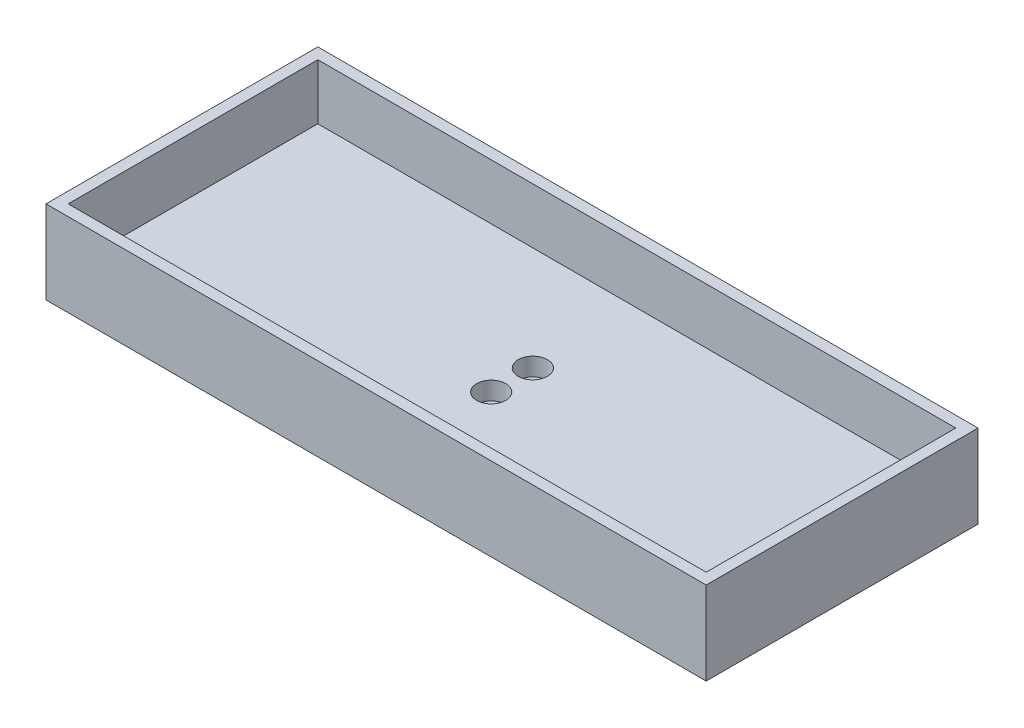
ISO-10303-21;
HEADER;
FILE_DESCRIPTION(('STEP AP214'),'2;1');
FILE_NAME('part.step','',(''),(''),'','','');
FILE_SCHEMA(('AUTOMOTIVE_DESIGN { 1 0 10303 214 1 1 1 1 }'));
ENDSEC;
DATA;
#1=APPLICATION_CONTEXT('core data for automotive mechanical design processes');
#2=APPLICATION_PROTOCOL_DEFINITION('international standard','automotive_design',2000,#1);
#3=PRODUCT_CONTEXT('',#1,'mechanical');
#4=PRODUCT('Part','Part','',(#3));
#5=PRODUCT_RELATED_PRODUCT_CATEGORY('part','',(#4));
#6=PRODUCT_DEFINITION_FORMATION('','',#4);
#7=PRODUCT_DEFINITION_CONTEXT('part definition',#1,'design');
#8=PRODUCT_DEFINITION('design','',#6,#7);
#9=PRODUCT_DEFINITION_SHAPE('','',#8);
#10=(LENGTH_UNIT() NAMED_UNIT(*) SI_UNIT(.MILLI.,.METRE.));
#11=(NAMED_UNIT(*) PLANE_ANGLE_UNIT() SI_UNIT($,.RADIAN.));
#12=(NAMED_UNIT(*) SI_UNIT($,.STERADIAN.) SOLID_ANGLE_UNIT());
#13=UNCERTAINTY_MEASURE_WITH_UNIT(LENGTH_MEASURE(1.E-05),#10,'distance_accuracy_value','');
#14=(GEOMETRIC_REPRESENTATION_CONTEXT(3) GLOBAL_UNCERTAINTY_ASSIGNED_CONTEXT((#13)) GLOBAL_UNIT_ASSIGNED_CONTEXT((#10,
#11,#12)) REPRESENTATION_CONTEXT('',''));
#15=CARTESIAN_POINT('',(0.,0.,0.));
#16=DIRECTION('',(0.,0.,1.));
#17=DIRECTION('',(1.,0.,0.));
#18=AXIS2_PLACEMENT_3D('',#15,#16,#17);
#19=CARTESIAN_POINT('',(0.,10.,0.));
#20=DIRECTION('',(0.,1.,0.));
#21=DIRECTION('',(0.,0.,1.));
#22=AXIS2_PLACEMENT_3D('',#19,#20,#21);
#23=PLANE('',#22);
#24=DIRECTION('',(0.,0.,1.));
#25=VECTOR('',#24,1.);
#26=CARTESIAN_POINT('',(-115.,10.,-45.));
#27=LINE('',#26,#25);
#28=CARTESIAN_POINT('',(-115.,10.,-45.));
#29=VERTEX_POINT('',#28);
#30=CARTESIAN_POINT('',(-115.,10.,45.));
#31=VERTEX_POINT('',#30);
#32=EDGE_CURVE('E104',#29,#31,#27,.T.);
#33=ORIENTED_EDGE('',*,*,#32,.T.);
#34=DIRECTION('',(1.,0.,0.));
#35=VECTOR('',#34,1.);
#36=CARTESIAN_POINT('',(-115.,10.,45.));
#37=LINE('',#36,#35);
#38=CARTESIAN_POINT('',(115.,10.,45.));
#39=VERTEX_POINT('',#38);
#40=EDGE_CURVE('E96',#31,#39,#37,.T.);
#41=ORIENTED_EDGE('',*,*,#40,.T.);
#42=DIRECTION('',(0.,0.,1.));
#43=VECTOR('',#42,1.);
#44=CARTESIAN_POINT('',(115.,10.,-45.));
#45=LINE('',#44,#43);
#46=CARTESIAN_POINT('',(115.,10.,-45.));
#47=VERTEX_POINT('',#46);
#48=EDGE_CURVE('E103',#47,#39,#45,.T.);
#49=ORIENTED_EDGE('',*,*,#48,.F.);
#50=DIRECTION('',(1.,0.,0.));
#51=VECTOR('',#50,1.);
#52=CARTESIAN_POINT('',(-115.,10.,-45.));
#53=LINE('',#52,#51);
#54=EDGE_CURVE('E117',#29,#47,#53,.T.);
#55=ORIENTED_EDGE('',*,*,#54,.F.);
#56=EDGE_LOOP('',(#33,#41,#49,#55));
#57=FACE_BOUND('',#56,.T.);
#58=CARTESIAN_POINT('',(0.,10.,7.5));
#59=DIRECTION('',(0.,-1.,0.));
#60=DIRECTION('',(0.,0.,-1.));
#61=AXIS2_PLACEMENT_3D('',#58,#59,#60);
#62=CIRCLE('',#61,5.25);
#63=CARTESIAN_POINT('',(0.,10.,12.75));
#64=VERTEX_POINT('',#63);
#65=EDGE_CURVE('E156',#64,#64,#62,.T.);
#66=ORIENTED_EDGE('',*,*,#65,.T.);
#67=EDGE_LOOP('',(#66));
#68=FACE_BOUND('',#67,.T.);
#69=CARTESIAN_POINT('',(0.,10.,-7.5));
#70=DIRECTION('',(0.,1.,0.));
#71=DIRECTION('',(0.,0.,1.));
#72=AXIS2_PLACEMENT_3D('',#69,#70,#71);
#73=CIRCLE('',#72,5.25);
#74=CARTESIAN_POINT('',(0.,10.,-2.25));
#75=VERTEX_POINT('',#74);
#76=EDGE_CURVE('E150',#75,#75,#73,.T.);
#77=ORIENTED_EDGE('',*,*,#76,.F.);
#78=EDGE_LOOP('',(#77));
#79=FACE_BOUND('',#78,.T.);
#80=ADVANCED_FACE('F51',(#57,#68,#79),#23,.T.);
#81=CARTESIAN_POINT('',(0.,0.,-7.5));
#82=DIRECTION('',(0.,1.,0.));
#83=DIRECTION('',(0.,0.,1.));
#84=AXIS2_PLACEMENT_3D('',#81,#82,#83);
#85=CYLINDRICAL_SURFACE('',#84,3.2);
#86=CARTESIAN_POINT('',(0.,0.,-7.5));
#87=DIRECTION('',(0.,1.,0.));
#88=DIRECTION('',(0.,0.,1.));
#89=AXIS2_PLACEMENT_3D('',#86,#87,#88);
#90=CIRCLE('',#89,3.2);
#91=CARTESIAN_POINT('',(0.,0.,-4.3));
#92=VERTEX_POINT('',#91);
#93=EDGE_CURVE('E126',#92,#92,#90,.T.);
#94=ORIENTED_EDGE('',*,*,#93,.F.);
#95=EDGE_LOOP('',(#94));
#96=FACE_BOUND('',#95,.T.);
#97=CARTESIAN_POINT('',(0.,3.5,-7.5));
#98=DIRECTION('',(0.,1.,0.));
#99=DIRECTION('',(0.,0.,1.));
#100=AXIS2_PLACEMENT_3D('',#97,#98,#99);
#101=CIRCLE('',#100,3.2);
#102=CARTESIAN_POINT('',(0.,3.5,-4.3));
#103=VERTEX_POINT('',#102);
#104=EDGE_CURVE('E139',#103,#103,#101,.F.);
#105=ORIENTED_EDGE('',*,*,#104,.F.);
#106=EDGE_LOOP('',(#105));
#107=FACE_BOUND('',#106,.T.);
#108=ADVANCED_FACE('F179',(#96,#107),#85,.F.);
#109=CARTESIAN_POINT('',(0.,0.,0.));
#110=DIRECTION('',(0.,1.,0.));
#111=DIRECTION('',(0.,0.,1.));
#112=AXIS2_PLACEMENT_3D('',#109,#110,#111);
#113=PLANE('',#112);
#114=DIRECTION('',(0.,0.,1.));
#115=VECTOR('',#114,1.);
#116=CARTESIAN_POINT('',(-115.,0.,-45.));
#117=LINE('',#116,#115);
#118=CARTESIAN_POINT('',(-115.,0.,-45.));
#119=VERTEX_POINT('',#118);
#120=CARTESIAN_POINT('',(-115.,0.,45.));
#121=VERTEX_POINT('',#120);
#122=EDGE_CURVE('E123',#119,#121,#117,.T.);
#123=ORIENTED_EDGE('',*,*,#122,.F.);
#124=DIRECTION('',(1.,0.,0.));
#125=VECTOR('',#124,1.);
#126=CARTESIAN_POINT('',(-115.,0.,-45.));
#127=LINE('',#126,#125);
#128=CARTESIAN_POINT('',(115.,0.,-45.));
#129=VERTEX_POINT('',#128);
#130=EDGE_CURVE('E132',#119,#129,#127,.T.);
#131=ORIENTED_EDGE('',*,*,#130,.T.);
#132=DIRECTION('',(0.,0.,1.));
#133=VECTOR('',#132,1.);
#134=CARTESIAN_POINT('',(115.,0.,-45.));
#135=LINE('',#134,#133);
#136=CARTESIAN_POINT('',(115.,0.,45.));
#137=VERTEX_POINT('',#136);
#138=EDGE_CURVE('E129',#129,#137,#135,.T.);
#139=ORIENTED_EDGE('',*,*,#138,.T.);
#140=DIRECTION('',(1.,0.,0.));
#141=VECTOR('',#140,1.);
#142=CARTESIAN_POINT('',(-115.,0.,45.));
#143=LINE('',#142,#141);
#144=EDGE_CURVE('E110',#121,#137,#143,.T.);
#145=ORIENTED_EDGE('',*,*,#144,.F.);
#146=EDGE_LOOP('',(#123,#131,#139,#145));
#147=FACE_BOUND('',#146,.T.);
#148=CARTESIAN_POINT('',(0.,0.,7.5));
#149=DIRECTION('',(0.,-1.,0.));
#150=DIRECTION('',(0.,0.,-1.));
#151=AXIS2_PLACEMENT_3D('',#148,#149,#150);
#152=CIRCLE('',#151,3.2);
#153=CARTESIAN_POINT('',(0.,0.,4.3));
#154=VERTEX_POINT('',#153);
#155=EDGE_CURVE('E148',#154,#154,#152,.T.);
#156=ORIENTED_EDGE('',*,*,#155,.F.);
#157=EDGE_LOOP('',(#156));
#158=FACE_BOUND('',#157,.T.);
#159=ORIENTED_EDGE('',*,*,#93,.T.);
#160=EDGE_LOOP('',(#159));
#161=FACE_BOUND('',#160,.T.);
#162=ADVANCED_FACE('F176',(#147,#158,#161),#113,.F.);
#163=CARTESIAN_POINT('',(-115.,10.,-45.));
#164=DIRECTION('',(1.,0.,0.));
#165=DIRECTION('',(0.,0.,-1.));
#166=AXIS2_PLACEMENT_3D('',#163,#164,#165);
#167=PLANE('',#166);
#168=ORIENTED_EDGE('',*,*,#122,.T.);
#169=DIRECTION('',(0.,-1.,0.));
#170=VECTOR('',#169,1.);
#171=CARTESIAN_POINT('',(-115.,10.,45.));
#172=LINE('',#171,#170);
#173=EDGE_CURVE('E12',#31,#121,#172,.T.);
#174=ORIENTED_EDGE('',*,*,#173,.F.);
#175=ORIENTED_EDGE('',*,*,#32,.F.);
#176=DIRECTION('',(0.,-1.,0.));
#177=VECTOR('',#176,1.);
#178=CARTESIAN_POINT('',(-115.,10.,-45.));
#179=LINE('',#178,#177);
#180=EDGE_CURVE('E71',#29,#119,#179,.T.);
#181=ORIENTED_EDGE('',*,*,#180,.T.);
#182=EDGE_LOOP('',(#168,#174,#175,#181));
#183=FACE_BOUND('',#182,.T.);
#184=ADVANCED_FACE('F53',(#183),#167,.F.);
#185=CARTESIAN_POINT('',(-115.,10.,45.));
#186=DIRECTION('',(0.,0.,-1.));
#187=DIRECTION('',(-1.,0.,0.));
#188=AXIS2_PLACEMENT_3D('',#185,#186,#187);
#189=PLANE('',#188);
#190=ORIENTED_EDGE('',*,*,#144,.T.);
#191=DIRECTION('',(0.,-1.,0.));
#192=VECTOR('',#191,1.);
#193=CARTESIAN_POINT('',(115.,10.,45.));
#194=LINE('',#193,#192);
#195=EDGE_CURVE('E62',#39,#137,#194,.T.);
#196=ORIENTED_EDGE('',*,*,#195,.F.);
#197=ORIENTED_EDGE('',*,*,#40,.F.);
#198=ORIENTED_EDGE('',*,*,#173,.T.);
#199=EDGE_LOOP('',(#190,#196,#197,#198));
#200=FACE_BOUND('',#199,.T.);
#201=ADVANCED_FACE('F109',(#200),#189,.F.);
#202=CARTESIAN_POINT('',(115.,10.,-45.));
#203=DIRECTION('',(1.,0.,0.));
#204=DIRECTION('',(0.,0.,-1.));
#205=AXIS2_PLACEMENT_3D('',#202,#203,#204);
#206=PLANE('',#205);
#207=ORIENTED_EDGE('',*,*,#138,.F.);
#208=DIRECTION('',(0.,-1.,0.));
#209=VECTOR('',#208,1.);
#210=CARTESIAN_POINT('',(115.,10.,-45.));
#211=LINE('',#210,#209);
#212=EDGE_CURVE('E85',#47,#129,#211,.T.);
#213=ORIENTED_EDGE('',*,*,#212,.F.);
#214=ORIENTED_EDGE('',*,*,#48,.T.);
#215=ORIENTED_EDGE('',*,*,#195,.T.);
#216=EDGE_LOOP('',(#207,#213,#214,#215));
#217=FACE_BOUND('',#216,.T.);
#218=ADVANCED_FACE('F115',(#217),#206,.T.);
#219=CARTESIAN_POINT('',(-115.,10.,-45.));
#220=DIRECTION('',(0.,0.,-1.));
#221=DIRECTION('',(-1.,0.,0.));
#222=AXIS2_PLACEMENT_3D('',#219,#220,#221);
#223=PLANE('',#222);
#224=ORIENTED_EDGE('',*,*,#130,.F.);
#225=ORIENTED_EDGE('',*,*,#180,.F.);
#226=ORIENTED_EDGE('',*,*,#54,.T.);
#227=ORIENTED_EDGE('',*,*,#212,.T.);
#228=EDGE_LOOP('',(#224,#225,#226,#227));
#229=FACE_BOUND('',#228,.T.);
#230=ADVANCED_FACE('F197',(#229),#223,.T.);
#231=CARTESIAN_POINT('',(0.,0.,7.5));
#232=DIRECTION('',(0.,1.,0.));
#233=DIRECTION('',(0.,0.,1.));
#234=AXIS2_PLACEMENT_3D('',#231,#232,#233);
#235=CYLINDRICAL_SURFACE('',#234,3.2);
#236=CARTESIAN_POINT('',(0.,3.5,7.5));
#237=DIRECTION('',(0.,-1.,0.));
#238=DIRECTION('',(0.,0.,-1.));
#239=AXIS2_PLACEMENT_3D('',#236,#237,#238);
#240=CIRCLE('',#239,3.2);
#241=CARTESIAN_POINT('',(0.,3.5,4.3));
#242=VERTEX_POINT('',#241);
#243=EDGE_CURVE('E55',#242,#242,#240,.T.);
#244=ORIENTED_EDGE('',*,*,#243,.F.);
#245=EDGE_LOOP('',(#244));
#246=FACE_BOUND('',#245,.T.);
#247=ORIENTED_EDGE('',*,*,#155,.T.);
#248=EDGE_LOOP('',(#247));
#249=FACE_BOUND('',#248,.T.);
#250=ADVANCED_FACE('F174',(#246,#249),#235,.F.);
#251=CARTESIAN_POINT('',(0.,3.5,-7.5));
#252=DIRECTION('',(0.,1.,0.));
#253=DIRECTION('',(0.,0.,1.));
#254=AXIS2_PLACEMENT_3D('',#251,#252,#253);
#255=PLANE('',#254);
#256=CARTESIAN_POINT('',(0.,3.5,-7.5));
#257=DIRECTION('',(0.,1.,0.));
#258=DIRECTION('',(0.,0.,1.));
#259=AXIS2_PLACEMENT_3D('',#256,#257,#258);
#260=CIRCLE('',#259,5.25);
#261=CARTESIAN_POINT('',(0.,3.5,-2.25));
#262=VERTEX_POINT('',#261);
#263=EDGE_CURVE('E142',#262,#262,#260,.T.);
#264=ORIENTED_EDGE('',*,*,#263,.T.);
#265=EDGE_LOOP('',(#264));
#266=FACE_BOUND('',#265,.T.);
#267=ORIENTED_EDGE('',*,*,#104,.T.);
#268=EDGE_LOOP('',(#267));
#269=FACE_BOUND('',#268,.T.);
#270=ADVANCED_FACE('F196',(#266,#269),#255,.T.);
#271=CARTESIAN_POINT('',(0.,3.5,-7.5));
#272=DIRECTION('',(0.,1.,0.));
#273=DIRECTION('',(0.,0.,1.));
#274=AXIS2_PLACEMENT_3D('',#271,#272,#273);
#275=CYLINDRICAL_SURFACE('',#274,5.25);
#276=CARTESIAN_POINT('',(0.,3.5,-2.25));
#277=CARTESIAN_POINT('',(0.,3.56770833333333,-2.25));
#278=CARTESIAN_POINT('',(0.,3.63541666666667,-2.25));
#279=CARTESIAN_POINT('',(0.,3.77083333333333,-2.25));
#280=CARTESIAN_POINT('',(0.,3.83854166666667,-2.25));
#281=CARTESIAN_POINT('',(0.,3.97395833333333,-2.25));
#282=CARTESIAN_POINT('',(0.,4.04166666666667,-2.25));
#283=CARTESIAN_POINT('',(0.,4.17708333333333,-2.25));
#284=CARTESIAN_POINT('',(0.,4.24479166666667,-2.25));
#285=CARTESIAN_POINT('',(0.,4.38020833333333,-2.25));
#286=CARTESIAN_POINT('',(0.,4.44791666666667,-2.25));
#287=CARTESIAN_POINT('',(0.,4.58333333333333,-2.25));
#288=CARTESIAN_POINT('',(0.,4.65104166666667,-2.25));
#289=CARTESIAN_POINT('',(0.,4.78645833333333,-2.25));
#290=CARTESIAN_POINT('',(0.,4.85416666666667,-2.25));
#291=CARTESIAN_POINT('',(0.,4.98958333333333,-2.25));
#292=CARTESIAN_POINT('',(0.,5.05729166666667,-2.25));
#293=CARTESIAN_POINT('',(0.,5.19270833333333,-2.25));
#294=CARTESIAN_POINT('',(0.,5.26041666666667,-2.25));
#295=CARTESIAN_POINT('',(0.,5.39583333333333,-2.25));
#296=CARTESIAN_POINT('',(0.,5.46354166666667,-2.25));
#297=CARTESIAN_POINT('',(0.,5.59895833333333,-2.25));
#298=CARTESIAN_POINT('',(0.,5.66666666666667,-2.25));
#299=CARTESIAN_POINT('',(0.,5.80208333333333,-2.25));
#300=CARTESIAN_POINT('',(0.,5.86979166666667,-2.25));
#301=CARTESIAN_POINT('',(0.,6.00520833333333,-2.25));
#302=CARTESIAN_POINT('',(0.,6.07291666666667,-2.25));
#303=CARTESIAN_POINT('',(0.,6.20833333333333,-2.25));
#304=CARTESIAN_POINT('',(0.,6.27604166666667,-2.25));
#305=CARTESIAN_POINT('',(0.,6.41145833333333,-2.25));
#306=CARTESIAN_POINT('',(0.,6.47916666666667,-2.25));
#307=CARTESIAN_POINT('',(0.,6.61458333333333,-2.25));
#308=CARTESIAN_POINT('',(0.,6.68229166666667,-2.25));
#309=CARTESIAN_POINT('',(0.,6.81770833333333,-2.25));
#310=CARTESIAN_POINT('',(0.,6.88541666666667,-2.25));
#311=CARTESIAN_POINT('',(0.,7.02083333333333,-2.25));
#312=CARTESIAN_POINT('',(0.,7.08854166666667,-2.25));
#313=CARTESIAN_POINT('',(0.,7.22395833333333,-2.25));
#314=CARTESIAN_POINT('',(0.,7.29166666666667,-2.25));
#315=CARTESIAN_POINT('',(0.,7.42708333333333,-2.25));
#316=CARTESIAN_POINT('',(0.,7.49479166666667,-2.25));
#317=CARTESIAN_POINT('',(0.,7.63020833333333,-2.25));
#318=CARTESIAN_POINT('',(0.,7.69791666666667,-2.25));
#319=CARTESIAN_POINT('',(0.,7.83333333333333,-2.25));
#320=CARTESIAN_POINT('',(0.,7.90104166666667,-2.25));
#321=CARTESIAN_POINT('',(0.,8.03645833333333,-2.25));
#322=CARTESIAN_POINT('',(0.,8.10416666666667,-2.25));
#323=CARTESIAN_POINT('',(0.,8.23958333333333,-2.25));
#324=CARTESIAN_POINT('',(0.,8.30729166666667,-2.25));
#325=CARTESIAN_POINT('',(0.,8.44270833333333,-2.25));
#326=CARTESIAN_POINT('',(0.,8.51041666666667,-2.25));
#327=CARTESIAN_POINT('',(0.,8.64583333333333,-2.25));
#328=CARTESIAN_POINT('',(0.,8.71354166666667,-2.25));
#329=CARTESIAN_POINT('',(0.,8.84895833333333,-2.25));
#330=CARTESIAN_POINT('',(0.,8.91666666666667,-2.25));
#331=CARTESIAN_POINT('',(0.,9.05208333333333,-2.25));
#332=CARTESIAN_POINT('',(0.,9.11979166666667,-2.25));
#333=CARTESIAN_POINT('',(0.,9.25520833333333,-2.25));
#334=CARTESIAN_POINT('',(0.,9.32291666666667,-2.25));
#335=CARTESIAN_POINT('',(0.,9.45833333333333,-2.25));
#336=CARTESIAN_POINT('',(0.,9.52604166666667,-2.25));
#337=CARTESIAN_POINT('',(0.,9.66145833333333,-2.25));
#338=CARTESIAN_POINT('',(0.,9.72916666666667,-2.25));
#339=CARTESIAN_POINT('',(0.,9.86458333333333,-2.25));
#340=CARTESIAN_POINT('',(0.,9.93229166666667,-2.25));
#341=CARTESIAN_POINT('',(0.,10.,-2.25));
#342=B_SPLINE_CURVE_WITH_KNOTS('',3,(#276,#277,#278,#279,#280,#281,#282,#283,#284,#285,#286,
#287,#288,#289,#290,#291,#292,#293,#294,#295,#296,#297,#298,#299,#300,#301,#302,#303,#304,#305,
#306,#307,#308,#309,#310,#311,#312,#313,#314,#315,#316,#317,#318,#319,#320,#321,#322,#323,#324,
#325,#326,#327,#328,#329,#330,#331,#332,#333,#334,#335,#336,#337,#338,#339,#340,#341),
.UNSPECIFIED.,.F.,.F.,(4,2,2,2,2,2,2,2,2,2,2,2,2,2,2,2,2,2,2,2,2,2,2,2,2,2,2,2,2,2,2,2,4),(0.,
0.203125,0.40625,0.609375,0.8125,1.015625,1.21875,1.421875,1.625,1.828125,2.03125,2.234375,
2.4375,2.640625,2.84375,3.046875,3.25,3.453125,3.65625,3.859375,4.0625,4.265625,4.46875,
4.671875,4.875,5.078125,5.28125,5.484375,5.6875,5.890625,6.09375,6.296875,6.5),.UNSPECIFIED.);
#343=EDGE_CURVE('BSEAM242',#262,#75,#342,.T.);
#344=ORIENTED_EDGE('',*,*,#263,.F.);
#345=ORIENTED_EDGE('',*,*,#76,.T.);
#346=ORIENTED_EDGE('',*,*,#343,.T.);
#347=ORIENTED_EDGE('',*,*,#343,.F.);
#348=EDGE_LOOP('',(#344,#346,#345,#347));
#349=FACE_BOUND('',#348,.T.);
#350=ADVANCED_FACE('F242',(#349),#275,.F.);
#351=CARTESIAN_POINT('',(0.,3.5,7.5));
#352=DIRECTION('',(0.,1.,0.));
#353=DIRECTION('',(0.,0.,1.));
#354=AXIS2_PLACEMENT_3D('',#351,#352,#353);
#355=CYLINDRICAL_SURFACE('',#354,5.25);
#356=CARTESIAN_POINT('',(0.,3.5,7.5));
#357=DIRECTION('',(0.,-1.,0.));
#358=DIRECTION('',(0.,0.,-1.));
#359=AXIS2_PLACEMENT_3D('',#356,#357,#358);
#360=CIRCLE('',#359,5.25);
#361=CARTESIAN_POINT('',(0.,3.5,12.75));
#362=VERTEX_POINT('',#361);
#363=EDGE_CURVE('E162',#362,#362,#360,.T.);
#364=CARTESIAN_POINT('',(0.,3.5,12.75));
#365=CARTESIAN_POINT('',(0.,3.56770833333333,12.75));
#366=CARTESIAN_POINT('',(0.,3.63541666666667,12.75));
#367=CARTESIAN_POINT('',(0.,3.77083333333333,12.75));
#368=CARTESIAN_POINT('',(0.,3.83854166666667,12.75));
#369=CARTESIAN_POINT('',(0.,3.97395833333333,12.75));
#370=CARTESIAN_POINT('',(0.,4.04166666666667,12.75));
#371=CARTESIAN_POINT('',(0.,4.17708333333333,12.75));
#372=CARTESIAN_POINT('',(0.,4.24479166666667,12.75));
#373=CARTESIAN_POINT('',(0.,4.38020833333333,12.75));
#374=CARTESIAN_POINT('',(0.,4.44791666666667,12.75));
#375=CARTESIAN_POINT('',(0.,4.58333333333333,12.75));
#376=CARTESIAN_POINT('',(0.,4.65104166666667,12.75));
#377=CARTESIAN_POINT('',(0.,4.78645833333333,12.75));
#378=CARTESIAN_POINT('',(0.,4.85416666666667,12.75));
#379=CARTESIAN_POINT('',(0.,4.98958333333333,12.75));
#380=CARTESIAN_POINT('',(0.,5.05729166666667,12.75));
#381=CARTESIAN_POINT('',(0.,5.19270833333333,12.75));
#382=CARTESIAN_POINT('',(0.,5.26041666666667,12.75));
#383=CARTESIAN_POINT('',(0.,5.39583333333333,12.75));
#384=CARTESIAN_POINT('',(0.,5.46354166666667,12.75));
#385=CARTESIAN_POINT('',(0.,5.59895833333333,12.75));
#386=CARTESIAN_POINT('',(0.,5.66666666666667,12.75));
#387=CARTESIAN_POINT('',(0.,5.80208333333333,12.75));
#388=CARTESIAN_POINT('',(0.,5.86979166666667,12.75));
#389=CARTESIAN_POINT('',(0.,6.00520833333333,12.75));
#390=CARTESIAN_POINT('',(0.,6.07291666666667,12.75));
#391=CARTESIAN_POINT('',(0.,6.20833333333333,12.75));
#392=CARTESIAN_POINT('',(0.,6.27604166666667,12.75));
#393=CARTESIAN_POINT('',(0.,6.41145833333333,12.75));
#394=CARTESIAN_POINT('',(0.,6.47916666666667,12.75));
#395=CARTESIAN_POINT('',(0.,6.61458333333333,12.75));
#396=CARTESIAN_POINT('',(0.,6.68229166666667,12.75));
#397=CARTESIAN_POINT('',(0.,6.81770833333333,12.75));
#398=CARTESIAN_POINT('',(0.,6.88541666666667,12.75));
#399=CARTESIAN_POINT('',(0.,7.02083333333333,12.75));
#400=CARTESIAN_POINT('',(0.,7.08854166666667,12.75));
#401=CARTESIAN_POINT('',(0.,7.22395833333333,12.75));
#402=CARTESIAN_POINT('',(0.,7.29166666666667,12.75));
#403=CARTESIAN_POINT('',(0.,7.42708333333333,12.75));
#404=CARTESIAN_POINT('',(0.,7.49479166666667,12.75));
#405=CARTESIAN_POINT('',(0.,7.63020833333333,12.75));
#406=CARTESIAN_POINT('',(0.,7.69791666666667,12.75));
#407=CARTESIAN_POINT('',(0.,7.83333333333333,12.75));
#408=CARTESIAN_POINT('',(0.,7.90104166666667,12.75));
#409=CARTESIAN_POINT('',(0.,8.03645833333333,12.75));
#410=CARTESIAN_POINT('',(0.,8.10416666666667,12.75));
#411=CARTESIAN_POINT('',(0.,8.23958333333333,12.75));
#412=CARTESIAN_POINT('',(0.,8.30729166666667,12.75));
#413=CARTESIAN_POINT('',(0.,8.44270833333333,12.75));
#414=CARTESIAN_POINT('',(0.,8.51041666666667,12.75));
#415=CARTESIAN_POINT('',(0.,8.64583333333333,12.75));
#416=CARTESIAN_POINT('',(0.,8.71354166666667,12.75));
#417=CARTESIAN_POINT('',(0.,8.84895833333333,12.75));
#418=CARTESIAN_POINT('',(0.,8.91666666666667,12.75));
#419=CARTESIAN_POINT('',(0.,9.05208333333333,12.75));
#420=CARTESIAN_POINT('',(0.,9.11979166666667,12.75));
#421=CARTESIAN_POINT('',(0.,9.25520833333333,12.75));
#422=CARTESIAN_POINT('',(0.,9.32291666666667,12.75));
#423=CARTESIAN_POINT('',(0.,9.45833333333333,12.75));
#424=CARTESIAN_POINT('',(0.,9.52604166666667,12.75));
#425=CARTESIAN_POINT('',(0.,9.66145833333333,12.75));
#426=CARTESIAN_POINT('',(0.,9.72916666666667,12.75));
#427=CARTESIAN_POINT('',(0.,9.86458333333333,12.75));
#428=CARTESIAN_POINT('',(0.,9.93229166666667,12.75));
#429=CARTESIAN_POINT('',(0.,10.,12.75));
#430=B_SPLINE_CURVE_WITH_KNOTS('',3,(#364,#365,#366,#367,#368,#369,#370,#371,#372,#373,#374,
#375,#376,#377,#378,#379,#380,#381,#382,#383,#384,#385,#386,#387,#388,#389,#390,#391,#392,#393,
#394,#395,#396,#397,#398,#399,#400,#401,#402,#403,#404,#405,#406,#407,#408,#409,#410,#411,#412,
#413,#414,#415,#416,#417,#418,#419,#420,#421,#422,#423,#424,#425,#426,#427,#428,#429),
.UNSPECIFIED.,.F.,.F.,(4,2,2,2,2,2,2,2,2,2,2,2,2,2,2,2,2,2,2,2,2,2,2,2,2,2,2,2,2,2,2,2,4),(0.,
0.203125,0.40625,0.609375000000001,0.8125,1.015625,1.21875,1.421875,1.625,1.828125,2.03125,
2.234375,2.4375,2.640625,2.84375,3.046875,3.25,3.453125,3.65625,3.859375,4.0625,4.265625,
4.46875,4.671875,4.875,5.078125,5.28125,5.484375,5.6875,5.890625,6.09375,6.296875,6.5),.UNSPECIFIED.);
#431=EDGE_CURVE('BSEAM251',#362,#64,#430,.T.);
#432=ORIENTED_EDGE('',*,*,#363,.T.);
#433=ORIENTED_EDGE('',*,*,#65,.F.);
#434=ORIENTED_EDGE('',*,*,#431,.T.);
#435=ORIENTED_EDGE('',*,*,#431,.F.);
#436=EDGE_LOOP('',(#432,#434,#433,#435));
#437=FACE_BOUND('',#436,.T.);
#438=ADVANCED_FACE('F251',(#437),#355,.F.);
#439=CARTESIAN_POINT('',(0.,3.5,7.5));
#440=DIRECTION('',(0.,-1.,0.));
#441=DIRECTION('',(0.,0.,-1.));
#442=AXIS2_PLACEMENT_3D('',#439,#440,#441);
#443=PLANE('',#442);
#444=ORIENTED_EDGE('',*,*,#243,.T.);
#445=EDGE_LOOP('',(#444));
#446=FACE_BOUND('',#445,.T.);
#447=ORIENTED_EDGE('',*,*,#363,.F.);
#448=EDGE_LOOP('',(#447));
#449=FACE_BOUND('',#448,.T.);
#450=ADVANCED_FACE('F193',(#446,#449),#443,.F.);
#451=CLOSED_SHELL('',(#80,#108,#162,#184,#201,#218,#230,#250,#270,#350,#438,#450));
#452=MANIFOLD_SOLID_BREP('B2',#451);
#453=CARTESIAN_POINT('',(0.,30.,0.));
#454=DIRECTION('',(0.,1.,0.));
#455=DIRECTION('',(0.,0.,1.));
#456=AXIS2_PLACEMENT_3D('',#453,#454,#455);
#457=PLANE('',#456);
#458=DIRECTION('',(0.,0.,1.));
#459=VECTOR('',#458,1.);
#460=CARTESIAN_POINT('',(-119.,30.,-49.));
#461=LINE('',#460,#459);
#462=CARTESIAN_POINT('',(-119.,30.,-49.));
#463=VERTEX_POINT('',#462);
#464=CARTESIAN_POINT('',(-119.,30.,49.));
#465=VERTEX_POINT('',#464);
#466=EDGE_CURVE('E398',#463,#465,#461,.T.);
#467=ORIENTED_EDGE('',*,*,#466,.T.);
#468=DIRECTION('',(1.,0.,0.));
#469=VECTOR('',#468,1.);
#470=CARTESIAN_POINT('',(-119.,30.,49.));
#471=LINE('',#470,#469);
#472=CARTESIAN_POINT('',(119.,30.,49.));
#473=VERTEX_POINT('',#472);
#474=EDGE_CURVE('E401',#465,#473,#471,.T.);
#475=ORIENTED_EDGE('',*,*,#474,.T.);
#476=DIRECTION('',(0.,0.,-1.));
#477=VECTOR('',#476,1.);
#478=CARTESIAN_POINT('',(119.,30.,-49.));
#479=LINE('',#478,#477);
#480=CARTESIAN_POINT('',(119.,30.,-49.));
#481=VERTEX_POINT('',#480);
#482=EDGE_CURVE('E404',#473,#481,#479,.T.);
#483=ORIENTED_EDGE('',*,*,#482,.T.);
#484=DIRECTION('',(-1.,0.,0.));
#485=VECTOR('',#484,1.);
#486=CARTESIAN_POINT('',(-119.,30.,-49.));
#487=LINE('',#486,#485);
#488=EDGE_CURVE('E406',#481,#463,#487,.T.);
#489=ORIENTED_EDGE('',*,*,#488,.T.);
#490=EDGE_LOOP('',(#467,#475,#483,#489));
#491=FACE_BOUND('',#490,.T.);
#492=DIRECTION('',(1.,0.,0.));
#493=VECTOR('',#492,1.);
#494=CARTESIAN_POINT('',(-115.,30.,45.));
#495=LINE('',#494,#493);
#496=CARTESIAN_POINT('',(-115.,30.,45.));
#497=VERTEX_POINT('',#496);
#498=CARTESIAN_POINT('',(115.,30.,45.));
#499=VERTEX_POINT('',#498);
#500=EDGE_CURVE('E370',#497,#499,#495,.T.);
#501=ORIENTED_EDGE('',*,*,#500,.F.);
#502=DIRECTION('',(0.,0.,1.));
#503=VECTOR('',#502,1.);
#504=CARTESIAN_POINT('',(-115.,30.,-45.));
#505=LINE('',#504,#503);
#506=CARTESIAN_POINT('',(-115.,30.,-45.));
#507=VERTEX_POINT('',#506);
#508=EDGE_CURVE('E362',#507,#497,#505,.T.);
#509=ORIENTED_EDGE('',*,*,#508,.F.);
#510=DIRECTION('',(-1.,0.,0.));
#511=VECTOR('',#510,1.);
#512=CARTESIAN_POINT('',(-115.,30.,-45.));
#513=LINE('',#512,#511);
#514=CARTESIAN_POINT('',(115.,30.,-45.));
#515=VERTEX_POINT('',#514);
#516=EDGE_CURVE('E384',#515,#507,#513,.T.);
#517=ORIENTED_EDGE('',*,*,#516,.F.);
#518=DIRECTION('',(0.,0.,-1.));
#519=VECTOR('',#518,1.);
#520=CARTESIAN_POINT('',(115.,30.,-45.));
#521=LINE('',#520,#519);
#522=EDGE_CURVE('E382',#499,#515,#521,.T.);
#523=ORIENTED_EDGE('',*,*,#522,.F.);
#524=EDGE_LOOP('',(#501,#509,#517,#523));
#525=FACE_BOUND('',#524,.T.);
#526=ADVANCED_FACE('F297',(#491,#525),#457,.T.);
#527=CARTESIAN_POINT('',(0.,0.,0.));
#528=DIRECTION('',(0.,1.,0.));
#529=DIRECTION('',(0.,0.,1.));
#530=AXIS2_PLACEMENT_3D('',#527,#528,#529);
#531=PLANE('',#530);
#532=DIRECTION('',(0.,0.,1.));
#533=VECTOR('',#532,1.);
#534=CARTESIAN_POINT('',(-119.,0.,-49.));
#535=LINE('',#534,#533);
#536=CARTESIAN_POINT('',(-119.,0.,-49.));
#537=VERTEX_POINT('',#536);
#538=CARTESIAN_POINT('',(-119.,0.,49.));
#539=VERTEX_POINT('',#538);
#540=EDGE_CURVE('E378',#537,#539,#535,.T.);
#541=ORIENTED_EDGE('',*,*,#540,.F.);
#542=DIRECTION('',(-1.,0.,0.));
#543=VECTOR('',#542,1.);
#544=CARTESIAN_POINT('',(-119.,0.,-49.));
#545=LINE('',#544,#543);
#546=CARTESIAN_POINT('',(119.,0.,-49.));
#547=VERTEX_POINT('',#546);
#548=EDGE_CURVE('E402',#547,#537,#545,.T.);
#549=ORIENTED_EDGE('',*,*,#548,.F.);
#550=DIRECTION('',(0.,0.,-1.));
#551=VECTOR('',#550,1.);
#552=CARTESIAN_POINT('',(119.,0.,-49.));
#553=LINE('',#552,#551);
#554=CARTESIAN_POINT('',(119.,0.,49.));
#555=VERTEX_POINT('',#554);
#556=EDGE_CURVE('E413',#555,#547,#553,.T.);
#557=ORIENTED_EDGE('',*,*,#556,.F.);
#558=DIRECTION('',(1.,0.,0.));
#559=VECTOR('',#558,1.);
#560=CARTESIAN_POINT('',(-119.,0.,49.));
#561=LINE('',#560,#559);
#562=EDGE_CURVE('E411',#539,#555,#561,.T.);
#563=ORIENTED_EDGE('',*,*,#562,.F.);
#564=EDGE_LOOP('',(#541,#549,#557,#563));
#565=FACE_BOUND('',#564,.T.);
#566=DIRECTION('',(0.,0.,1.));
#567=VECTOR('',#566,1.);
#568=CARTESIAN_POINT('',(-115.,0.,-45.));
#569=LINE('',#568,#567);
#570=CARTESIAN_POINT('',(-115.,0.,-45.));
#571=VERTEX_POINT('',#570);
#572=CARTESIAN_POINT('',(-115.,0.,45.));
#573=VERTEX_POINT('',#572);
#574=EDGE_CURVE('E320',#571,#573,#569,.T.);
#575=ORIENTED_EDGE('',*,*,#574,.T.);
#576=DIRECTION('',(1.,0.,0.));
#577=VECTOR('',#576,1.);
#578=CARTESIAN_POINT('',(-115.,0.,45.));
#579=LINE('',#578,#577);
#580=CARTESIAN_POINT('',(115.,0.,45.));
#581=VERTEX_POINT('',#580);
#582=EDGE_CURVE('E377',#573,#581,#579,.T.);
#583=ORIENTED_EDGE('',*,*,#582,.T.);
#584=DIRECTION('',(0.,0.,-1.));
#585=VECTOR('',#584,1.);
#586=CARTESIAN_POINT('',(115.,0.,-45.));
#587=LINE('',#586,#585);
#588=CARTESIAN_POINT('',(115.,0.,-45.));
#589=VERTEX_POINT('',#588);
#590=EDGE_CURVE('E390',#581,#589,#587,.T.);
#591=ORIENTED_EDGE('',*,*,#590,.T.);
#592=DIRECTION('',(-1.,0.,0.));
#593=VECTOR('',#592,1.);
#594=CARTESIAN_POINT('',(-115.,0.,-45.));
#595=LINE('',#594,#593);
#596=EDGE_CURVE('E371',#589,#571,#595,.T.);
#597=ORIENTED_EDGE('',*,*,#596,.T.);
#598=EDGE_LOOP('',(#575,#583,#591,#597));
#599=FACE_BOUND('',#598,.T.);
#600=ADVANCED_FACE('F431',(#565,#599),#531,.F.);
#601=CARTESIAN_POINT('',(-119.,30.,-49.));
#602=DIRECTION('',(1.,0.,0.));
#603=DIRECTION('',(0.,0.,-1.));
#604=AXIS2_PLACEMENT_3D('',#601,#602,#603);
#605=PLANE('',#604);
#606=ORIENTED_EDGE('',*,*,#540,.T.);
#607=DIRECTION('',(0.,-1.,0.));
#608=VECTOR('',#607,1.);
#609=CARTESIAN_POINT('',(-119.,30.,49.));
#610=LINE('',#609,#608);
#611=EDGE_CURVE('E49',#465,#539,#610,.T.);
#612=ORIENTED_EDGE('',*,*,#611,.F.);
#613=ORIENTED_EDGE('',*,*,#466,.F.);
#614=DIRECTION('',(0.,-1.,0.));
#615=VECTOR('',#614,1.);
#616=CARTESIAN_POINT('',(-119.,30.,-49.));
#617=LINE('',#616,#615);
#618=EDGE_CURVE('E408',#463,#537,#617,.T.);
#619=ORIENTED_EDGE('',*,*,#618,.T.);
#620=EDGE_LOOP('',(#606,#612,#613,#619));
#621=FACE_BOUND('',#620,.T.);
#622=ADVANCED_FACE('F299',(#621),#605,.F.);
#623=CARTESIAN_POINT('',(-119.,30.,49.));
#624=DIRECTION('',(0.,0.,-1.));
#625=DIRECTION('',(-1.,0.,0.));
#626=AXIS2_PLACEMENT_3D('',#623,#624,#625);
#627=PLANE('',#626);
#628=ORIENTED_EDGE('',*,*,#562,.T.);
#629=DIRECTION('',(0.,-1.,0.));
#630=VECTOR('',#629,1.);
#631=CARTESIAN_POINT('',(119.,30.,49.));
#632=LINE('',#631,#630);
#633=EDGE_CURVE('E305',#473,#555,#632,.T.);
#634=ORIENTED_EDGE('',*,*,#633,.F.);
#635=ORIENTED_EDGE('',*,*,#474,.F.);
#636=ORIENTED_EDGE('',*,*,#611,.T.);
#637=EDGE_LOOP('',(#628,#634,#635,#636));
#638=FACE_BOUND('',#637,.T.);
#639=ADVANCED_FACE('F441',(#638),#627,.F.);
#640=CARTESIAN_POINT('',(119.,30.,-49.));
#641=DIRECTION('',(-1.,0.,0.));
#642=DIRECTION('',(0.,0.,1.));
#643=AXIS2_PLACEMENT_3D('',#640,#641,#642);
#644=PLANE('',#643);
#645=ORIENTED_EDGE('',*,*,#556,.T.);
#646=DIRECTION('',(0.,-1.,0.));
#647=VECTOR('',#646,1.);
#648=CARTESIAN_POINT('',(119.,30.,-49.));
#649=LINE('',#648,#647);
#650=EDGE_CURVE('E418',#481,#547,#649,.T.);
#651=ORIENTED_EDGE('',*,*,#650,.F.);
#652=ORIENTED_EDGE('',*,*,#482,.F.);
#653=ORIENTED_EDGE('',*,*,#633,.T.);
#654=EDGE_LOOP('',(#645,#651,#652,#653));
#655=FACE_BOUND('',#654,.T.);
#656=ADVANCED_FACE('F425',(#655),#644,.F.);
#657=CARTESIAN_POINT('',(-119.,30.,-49.));
#658=DIRECTION('',(0.,0.,1.));
#659=DIRECTION('',(1.,0.,0.));
#660=AXIS2_PLACEMENT_3D('',#657,#658,#659);
#661=PLANE('',#660);
#662=ORIENTED_EDGE('',*,*,#548,.T.);
#663=ORIENTED_EDGE('',*,*,#618,.F.);
#664=ORIENTED_EDGE('',*,*,#488,.F.);
#665=ORIENTED_EDGE('',*,*,#650,.T.);
#666=EDGE_LOOP('',(#662,#663,#664,#665));
#667=FACE_BOUND('',#666,.T.);
#668=ADVANCED_FACE('F435',(#667),#661,.F.);
#669=CARTESIAN_POINT('',(-115.,30.,-45.));
#670=DIRECTION('',(1.,0.,0.));
#671=DIRECTION('',(0.,0.,-1.));
#672=AXIS2_PLACEMENT_3D('',#669,#670,#671);
#673=PLANE('',#672);
#674=ORIENTED_EDGE('',*,*,#574,.F.);
#675=DIRECTION('',(0.,-1.,0.));
#676=VECTOR('',#675,1.);
#677=CARTESIAN_POINT('',(-115.,30.,-45.));
#678=LINE('',#677,#676);
#679=EDGE_CURVE('E366',#507,#571,#678,.T.);
#680=ORIENTED_EDGE('',*,*,#679,.F.);
#681=ORIENTED_EDGE('',*,*,#508,.T.);
#682=DIRECTION('',(0.,-1.,0.));
#683=VECTOR('',#682,1.);
#684=CARTESIAN_POINT('',(-115.,30.,45.));
#685=LINE('',#684,#683);
#686=EDGE_CURVE('E365',#497,#573,#685,.T.);
#687=ORIENTED_EDGE('',*,*,#686,.T.);
#688=EDGE_LOOP('',(#674,#680,#681,#687));
#689=FACE_BOUND('',#688,.T.);
#690=ADVANCED_FACE('F364',(#689),#673,.T.);
#691=CARTESIAN_POINT('',(-115.,30.,45.));
#692=DIRECTION('',(0.,0.,-1.));
#693=DIRECTION('',(-1.,0.,0.));
#694=AXIS2_PLACEMENT_3D('',#691,#692,#693);
#695=PLANE('',#694);
#696=ORIENTED_EDGE('',*,*,#582,.F.);
#697=ORIENTED_EDGE('',*,*,#686,.F.);
#698=ORIENTED_EDGE('',*,*,#500,.T.);
#699=DIRECTION('',(0.,-1.,0.));
#700=VECTOR('',#699,1.);
#701=CARTESIAN_POINT('',(115.,30.,45.));
#702=LINE('',#701,#700);
#703=EDGE_CURVE('E379',#499,#581,#702,.T.);
#704=ORIENTED_EDGE('',*,*,#703,.T.);
#705=EDGE_LOOP('',(#696,#697,#698,#704));
#706=FACE_BOUND('',#705,.T.);
#707=ADVANCED_FACE('F374',(#706),#695,.T.);
#708=CARTESIAN_POINT('',(115.,30.,-45.));
#709=DIRECTION('',(-1.,0.,0.));
#710=DIRECTION('',(0.,0.,1.));
#711=AXIS2_PLACEMENT_3D('',#708,#709,#710);
#712=PLANE('',#711);
#713=ORIENTED_EDGE('',*,*,#590,.F.);
#714=ORIENTED_EDGE('',*,*,#703,.F.);
#715=ORIENTED_EDGE('',*,*,#522,.T.);
#716=DIRECTION('',(0.,-1.,0.));
#717=VECTOR('',#716,1.);
#718=CARTESIAN_POINT('',(115.,30.,-45.));
#719=LINE('',#718,#717);
#720=EDGE_CURVE('E312',#515,#589,#719,.T.);
#721=ORIENTED_EDGE('',*,*,#720,.T.);
#722=EDGE_LOOP('',(#713,#714,#715,#721));
#723=FACE_BOUND('',#722,.T.);
#724=ADVANCED_FACE('F464',(#723),#712,.T.);
#725=CARTESIAN_POINT('',(-115.,30.,-45.));
#726=DIRECTION('',(0.,0.,1.));
#727=DIRECTION('',(1.,0.,0.));
#728=AXIS2_PLACEMENT_3D('',#725,#726,#727);
#729=PLANE('',#728);
#730=ORIENTED_EDGE('',*,*,#596,.F.);
#731=ORIENTED_EDGE('',*,*,#720,.F.);
#732=ORIENTED_EDGE('',*,*,#516,.T.);
#733=ORIENTED_EDGE('',*,*,#679,.T.);
#734=EDGE_LOOP('',(#730,#731,#732,#733));
#735=FACE_BOUND('',#734,.T.);
#736=ADVANCED_FACE('F468',(#735),#729,.T.);
#737=CLOSED_SHELL('',(#526,#600,#622,#639,#656,#668,#690,#707,#724,#736));
#738=MANIFOLD_SOLID_BREP('B6',#737);
#739=ADVANCED_BREP_SHAPE_REPRESENTATION('',(#18,#452,#738),#14);
#740=SHAPE_DEFINITION_REPRESENTATION(#9,#739);
ENDSEC;
END-ISO-10303-21;
